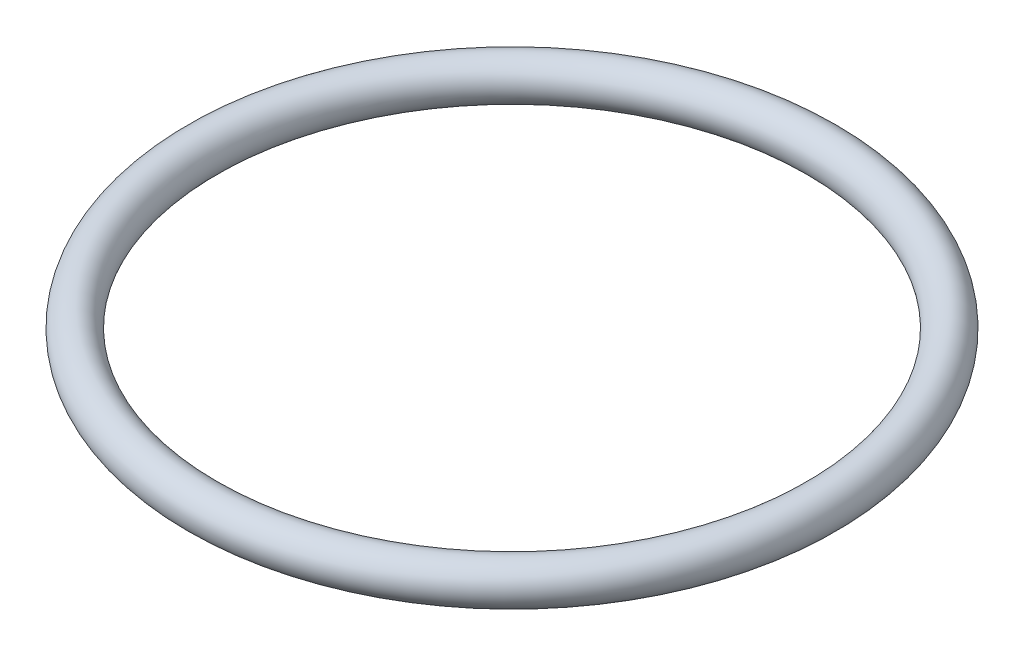
ISO-10303-21;
HEADER;
FILE_DESCRIPTION(('STEP AP214'),'2;1');
FILE_NAME('part.step','',(''),(''),'','','');
FILE_SCHEMA(('AUTOMOTIVE_DESIGN { 1 0 10303 214 1 1 1 1 }'));
ENDSEC;
DATA;
#1=APPLICATION_CONTEXT('core data for automotive mechanical design processes');
#2=APPLICATION_PROTOCOL_DEFINITION('international standard','automotive_design',2000,#1);
#3=PRODUCT_CONTEXT('',#1,'mechanical');
#4=PRODUCT('Part','Part','',(#3));
#5=PRODUCT_RELATED_PRODUCT_CATEGORY('part','',(#4));
#6=PRODUCT_DEFINITION_FORMATION('','',#4);
#7=PRODUCT_DEFINITION_CONTEXT('part definition',#1,'design');
#8=PRODUCT_DEFINITION('design','',#6,#7);
#9=PRODUCT_DEFINITION_SHAPE('','',#8);
#10=(LENGTH_UNIT() NAMED_UNIT(*) SI_UNIT(.MILLI.,.METRE.));
#11=(NAMED_UNIT(*) PLANE_ANGLE_UNIT() SI_UNIT($,.RADIAN.));
#12=(NAMED_UNIT(*) SI_UNIT($,.STERADIAN.) SOLID_ANGLE_UNIT());
#13=UNCERTAINTY_MEASURE_WITH_UNIT(LENGTH_MEASURE(1.E-05),#10,'distance_accuracy_value','');
#14=(GEOMETRIC_REPRESENTATION_CONTEXT(3) GLOBAL_UNCERTAINTY_ASSIGNED_CONTEXT((#13)) GLOBAL_UNIT_ASSIGNED_CONTEXT((#10,
#11,#12)) REPRESENTATION_CONTEXT('',''));
#15=CARTESIAN_POINT('',(0.,0.,0.));
#16=DIRECTION('',(0.,0.,1.));
#17=DIRECTION('',(1.,0.,0.));
#18=AXIS2_PLACEMENT_3D('',#15,#16,#17);
#19=CARTESIAN_POINT('',(0.,0.,0.));
#20=DIRECTION('',(0.,1.,0.));
#21=DIRECTION('',(0.,0.,1.));
#22=AXIS2_PLACEMENT_3D('',#19,#20,#21);
#23=TOROIDAL_SURFACE('',#22,190.,12.5);
#24=CARTESIAN_POINT('',(0.,0.,202.5));
#25=VERTEX_POINT('',#24);
#26=VERTEX_LOOP('',#25);
#27=FACE_BOUND('',#26,.T.);
#28=ADVANCED_FACE('F31',(#27),#23,.T.);
#29=CLOSED_SHELL('',(#28));
#30=CARTESIAN_POINT('',(0.,0.,0.));
#31=DIRECTION('',(0.,1.,0.));
#32=DIRECTION('',(0.,0.,1.));
#33=AXIS2_PLACEMENT_3D('',#30,#31,#32);
#34=TOROIDAL_SURFACE('',#33,190.,9.50000000000001);
#35=CARTESIAN_POINT('',(0.,0.,199.5));
#36=VERTEX_POINT('',#35);
#37=VERTEX_LOOP('',#36);
#38=FACE_BOUND('',#37,.T.);
#39=ADVANCED_FACE('F33',(#38),#34,.F.);
#40=CLOSED_SHELL('',(#39));
#41=ORIENTED_CLOSED_SHELL('',*,#40,.T.);
#42=BREP_WITH_VOIDS('B2',#29,(#41));
#43=ADVANCED_BREP_SHAPE_REPRESENTATION('',(#18,#42),#14);
#44=SHAPE_DEFINITION_REPRESENTATION(#9,#43);
ENDSEC;
END-ISO-10303-21;
